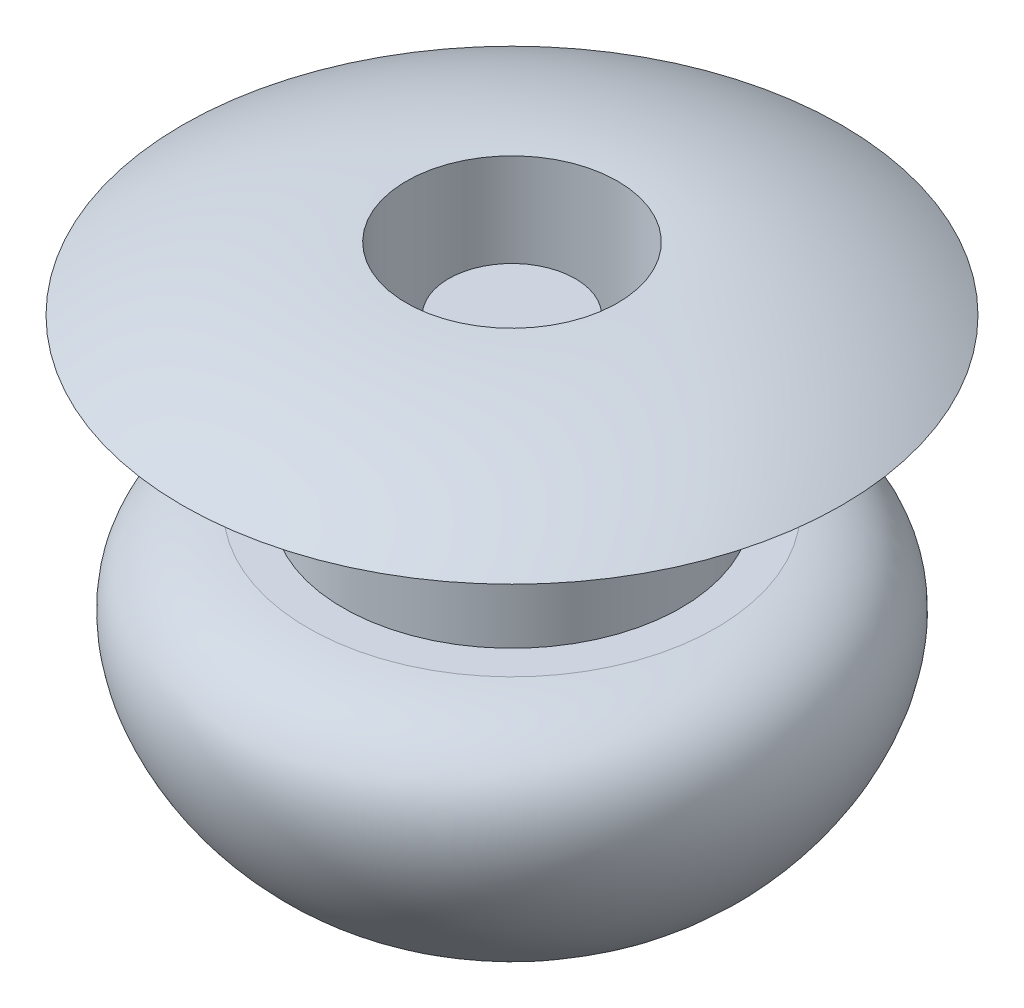
ISO-10303-21;
HEADER;
FILE_DESCRIPTION(('STEP AP214'),'2;1');
FILE_NAME('part.step','',(''),(''),'','','');
FILE_SCHEMA(('AUTOMOTIVE_DESIGN { 1 0 10303 214 1 1 1 1 }'));
ENDSEC;
DATA;
#1=APPLICATION_CONTEXT('core data for automotive mechanical design processes');
#2=APPLICATION_PROTOCOL_DEFINITION('international standard','automotive_design',2000,#1);
#3=PRODUCT_CONTEXT('',#1,'mechanical');
#4=PRODUCT('Part','Part','',(#3));
#5=PRODUCT_RELATED_PRODUCT_CATEGORY('part','',(#4));
#6=PRODUCT_DEFINITION_FORMATION('','',#4);
#7=PRODUCT_DEFINITION_CONTEXT('part definition',#1,'design');
#8=PRODUCT_DEFINITION('design','',#6,#7);
#9=PRODUCT_DEFINITION_SHAPE('','',#8);
#10=(LENGTH_UNIT() NAMED_UNIT(*) SI_UNIT(.MILLI.,.METRE.));
#11=(NAMED_UNIT(*) PLANE_ANGLE_UNIT() SI_UNIT($,.RADIAN.));
#12=(NAMED_UNIT(*) SI_UNIT($,.STERADIAN.) SOLID_ANGLE_UNIT());
#13=UNCERTAINTY_MEASURE_WITH_UNIT(LENGTH_MEASURE(1.E-05),#10,'distance_accuracy_value','');
#14=(GEOMETRIC_REPRESENTATION_CONTEXT(3) GLOBAL_UNCERTAINTY_ASSIGNED_CONTEXT((#13)) GLOBAL_UNIT_ASSIGNED_CONTEXT((#10,
#11,#12)) REPRESENTATION_CONTEXT('',''));
#15=CARTESIAN_POINT('',(0.,0.,0.));
#16=DIRECTION('',(0.,0.,1.));
#17=DIRECTION('',(1.,0.,0.));
#18=AXIS2_PLACEMENT_3D('',#15,#16,#17);
#19=CARTESIAN_POINT('',(0.,0.,0.));
#20=DIRECTION('',(0.,-1.,0.));
#21=DIRECTION('',(0.,0.,-1.));
#22=AXIS2_PLACEMENT_3D('',#19,#20,#21);
#23=PLANE('',#22);
#24=CARTESIAN_POINT('',(0.,0.,0.));
#25=DIRECTION('',(0.,-1.,0.));
#26=DIRECTION('',(0.,0.,-1.));
#27=AXIS2_PLACEMENT_3D('',#24,#25,#26);
#28=CIRCLE('',#27,0.75);
#29=CARTESIAN_POINT('',(0.,0.,-0.75));
#30=VERTEX_POINT('',#29);
#31=EDGE_CURVE('E11',#30,#30,#28,.T.);
#32=ORIENTED_EDGE('',*,*,#31,.F.);
#33=EDGE_LOOP('',(#32));
#34=FACE_BOUND('',#33,.T.);
#35=ADVANCED_FACE('F31',(#34),#23,.F.);
#36=CARTESIAN_POINT('',(0.,0.,0.));
#37=DIRECTION('',(0.,-1.,0.));
#38=DIRECTION('',(0.,0.,-1.));
#39=AXIS2_PLACEMENT_3D('',#36,#37,#38);
#40=CYLINDRICAL_SURFACE('',#39,0.75);
#41=CARTESIAN_POINT('',(0.,-2.20073852298997,0.));
#42=DIRECTION('',(0.,-1.,0.));
#43=DIRECTION('',(0.,0.,-1.));
#44=AXIS2_PLACEMENT_3D('',#41,#42,#43);
#45=CIRCLE('',#44,0.75);
#46=CARTESIAN_POINT('',(0.,-2.20073852298997,-0.75));
#47=VERTEX_POINT('',#46);
#48=EDGE_CURVE('E37',#47,#47,#45,.T.);
#49=ORIENTED_EDGE('',*,*,#48,.F.);
#50=EDGE_LOOP('',(#49));
#51=FACE_BOUND('',#50,.T.);
#52=ORIENTED_EDGE('',*,*,#31,.T.);
#53=EDGE_LOOP('',(#52));
#54=FACE_BOUND('',#53,.T.);
#55=ADVANCED_FACE('F76',(#51,#54),#40,.T.);
#56=CARTESIAN_POINT('',(2.22044604925031E-13,-2.20073852298997,0.750000000000695));
#57=DIRECTION('',(0.,-1.,0.));
#58=DIRECTION('',(0.,0.,-1.));
#59=AXIS2_PLACEMENT_3D('',#56,#57,#58);
#60=PLANE('',#59);
#61=CARTESIAN_POINT('',(0.,-2.20073852298997,0.));
#62=DIRECTION('',(0.,-1.,0.));
#63=DIRECTION('',(0.,0.,-1.));
#64=AXIS2_PLACEMENT_3D('',#61,#62,#63);
#65=CIRCLE('',#64,1.25);
#66=CARTESIAN_POINT('',(0.,-2.20073852298997,-1.25));
#67=VERTEX_POINT('',#66);
#68=EDGE_CURVE('E69',#67,#67,#65,.T.);
#69=ORIENTED_EDGE('',*,*,#68,.F.);
#70=EDGE_LOOP('',(#69));
#71=FACE_BOUND('',#70,.T.);
#72=ORIENTED_EDGE('',*,*,#48,.T.);
#73=EDGE_LOOP('',(#72));
#74=FACE_BOUND('',#73,.T.);
#75=ADVANCED_FACE('F74',(#71,#74),#60,.F.);
#76=CARTESIAN_POINT('',(0.,0.,0.));
#77=DIRECTION('',(0.,-1.,0.));
#78=DIRECTION('',(0.,0.,-1.));
#79=AXIS2_PLACEMENT_3D('',#76,#77,#78);
#80=CYLINDRICAL_SURFACE('',#79,1.25);
#81=CARTESIAN_POINT('',(0.,0.75,0.));
#82=DIRECTION('',(0.,-1.,0.));
#83=DIRECTION('',(0.,0.,-1.));
#84=AXIS2_PLACEMENT_3D('',#81,#82,#83);
#85=CIRCLE('',#84,1.25);
#86=CARTESIAN_POINT('',(0.,0.75,-1.25));
#87=VERTEX_POINT('',#86);
#88=EDGE_CURVE('E66',#87,#87,#85,.T.);
#89=ORIENTED_EDGE('',*,*,#88,.F.);
#90=EDGE_LOOP('',(#89));
#91=FACE_BOUND('',#90,.T.);
#92=ORIENTED_EDGE('',*,*,#68,.T.);
#93=EDGE_LOOP('',(#92));
#94=FACE_BOUND('',#93,.T.);
#95=ADVANCED_FACE('F94',(#91,#94),#80,.F.);
#96=CARTESIAN_POINT('',(0.,-4.30666666666667,0.));
#97=DIRECTION('',(0.,-1.,0.));
#98=DIRECTION('',(0.,0.,-1.));
#99=AXIS2_PLACEMENT_3D('',#96,#97,#98);
#100=DEGENERATE_TOROIDAL_SURFACE('',#99,1.25,5.05666666666667,.T.);
#101=CARTESIAN_POINT('',(0.,0.,0.));
#102=DIRECTION('',(0.,-1.,0.));
#103=DIRECTION('',(0.,0.,-1.));
#104=AXIS2_PLACEMENT_3D('',#101,#102,#103);
#105=CIRCLE('',#104,3.9);
#106=CARTESIAN_POINT('',(0.,0.,-3.9));
#107=VERTEX_POINT('',#106);
#108=EDGE_CURVE('E63',#107,#107,#105,.T.);
#109=ORIENTED_EDGE('',*,*,#108,.F.);
#110=EDGE_LOOP('',(#109));
#111=FACE_BOUND('',#110,.T.);
#112=ORIENTED_EDGE('',*,*,#88,.T.);
#113=EDGE_LOOP('',(#112));
#114=FACE_BOUND('',#113,.T.);
#115=ADVANCED_FACE('F102',(#111,#114),#100,.T.);
#116=CARTESIAN_POINT('',(0.,0.,3.90000000000001));
#117=DIRECTION('',(0.,1.,0.));
#118=DIRECTION('',(0.,0.,1.));
#119=AXIS2_PLACEMENT_3D('',#116,#117,#118);
#120=PLANE('',#119);
#121=CARTESIAN_POINT('',(0.,0.,0.));
#122=DIRECTION('',(0.,-1.,0.));
#123=DIRECTION('',(0.,0.,-1.));
#124=AXIS2_PLACEMENT_3D('',#121,#122,#123);
#125=CIRCLE('',#124,2.);
#126=CARTESIAN_POINT('',(0.,0.,-2.));
#127=VERTEX_POINT('',#126);
#128=EDGE_CURVE('E60',#127,#127,#125,.T.);
#129=ORIENTED_EDGE('',*,*,#128,.F.);
#130=EDGE_LOOP('',(#129));
#131=FACE_BOUND('',#130,.T.);
#132=ORIENTED_EDGE('',*,*,#108,.T.);
#133=EDGE_LOOP('',(#132));
#134=FACE_BOUND('',#133,.T.);
#135=ADVANCED_FACE('F110',(#131,#134),#120,.F.);
#136=CARTESIAN_POINT('',(0.,0.,0.));
#137=DIRECTION('',(0.,-1.,0.));
#138=DIRECTION('',(0.,0.,-1.));
#139=AXIS2_PLACEMENT_3D('',#136,#137,#138);
#140=CYLINDRICAL_SURFACE('',#139,2.);
#141=CARTESIAN_POINT('',(0.,-2.,0.));
#142=DIRECTION('',(0.,-1.,0.));
#143=DIRECTION('',(0.,0.,-1.));
#144=AXIS2_PLACEMENT_3D('',#141,#142,#143);
#145=CIRCLE('',#144,2.);
#146=CARTESIAN_POINT('',(0.,-2.,-2.));
#147=VERTEX_POINT('',#146);
#148=EDGE_CURVE('E52',#147,#147,#145,.T.);
#149=ORIENTED_EDGE('',*,*,#148,.F.);
#150=EDGE_LOOP('',(#149));
#151=FACE_BOUND('',#150,.T.);
#152=ORIENTED_EDGE('',*,*,#128,.T.);
#153=EDGE_LOOP('',(#152));
#154=FACE_BOUND('',#153,.T.);
#155=ADVANCED_FACE('F118',(#151,#154),#140,.T.);
#156=CARTESIAN_POINT('',(1.11022302462516E-13,-2.,2.00000000000022));
#157=DIRECTION('',(0.,-1.,0.));
#158=DIRECTION('',(0.,0.,-1.));
#159=AXIS2_PLACEMENT_3D('',#156,#157,#158);
#160=PLANE('',#159);
#161=CARTESIAN_POINT('',(0.,-2.,0.));
#162=DIRECTION('',(0.,-1.,0.));
#163=DIRECTION('',(0.,0.,-1.));
#164=AXIS2_PLACEMENT_3D('',#161,#162,#163);
#165=CIRCLE('',#164,2.4138917546613);
#166=CARTESIAN_POINT('',(0.,-2.,-2.4138917546613));
#167=VERTEX_POINT('',#166);
#168=EDGE_CURVE('E49',#167,#167,#165,.T.);
#169=ORIENTED_EDGE('',*,*,#168,.F.);
#170=EDGE_LOOP('',(#169));
#171=FACE_BOUND('',#170,.T.);
#172=ORIENTED_EDGE('',*,*,#148,.T.);
#173=EDGE_LOOP('',(#172));
#174=FACE_BOUND('',#173,.T.);
#175=ADVANCED_FACE('F126',(#171,#174),#160,.F.);
#176=CARTESIAN_POINT('',(8.88178419700125E-13,-2.,2.413891754662));
#177=CARTESIAN_POINT('',(0.,-2.16965732172857,3.86750311174056));
#178=CARTESIAN_POINT('',(4.44089209850063E-13,-4.30201362643837,3.52887764908694));
#179=CARTESIAN_POINT('',(6.66133814775094E-13,-5.87353236883243,1.08396164238544));
#180=CARTESIAN_POINT('',(3.33066907387547E-13,-3.87494929761665,0.27175261754997));
#181=CARTESIAN_POINT('',(0.,-3.57892919358065,0.956030426512822));
#182=B_SPLINE_CURVE_WITH_KNOTS('',3,(#176,#177,#178,#179,#180,#181),.UNSPECIFIED.,.F.,.F.,(4,1,
1,4),(0.,0.464993081764921,0.721927552661067,1.),.UNSPECIFIED.);
#183=CARTESIAN_POINT('',(0.,0.,0.));
#184=DIRECTION('',(0.,-1.,0.));
#185=AXIS1_PLACEMENT('',#183,#184);
#186=SURFACE_OF_REVOLUTION('',#182,#185);
#187=CARTESIAN_POINT('',(0.,-3.57892919358065,0.));
#188=DIRECTION('',(0.,-1.,0.));
#189=DIRECTION('',(0.,0.,-1.));
#190=AXIS2_PLACEMENT_3D('',#187,#188,#189);
#191=CIRCLE('',#190,0.956030426512505);
#192=CARTESIAN_POINT('',(0.,-3.57892919358065,-0.956030426512505));
#193=VERTEX_POINT('',#192);
#194=EDGE_CURVE('E47',#193,#193,#191,.T.);
#195=ORIENTED_EDGE('',*,*,#194,.F.);
#196=EDGE_LOOP('',(#195));
#197=FACE_BOUND('',#196,.T.);
#198=ORIENTED_EDGE('',*,*,#168,.T.);
#199=EDGE_LOOP('',(#198));
#200=FACE_BOUND('',#199,.T.);
#201=ADVANCED_FACE('F43',(#197,#200),#186,.T.);
#202=CARTESIAN_POINT('',(0.,-2.95073852298997,0.));
#203=DIRECTION('',(1.,0.,0.));
#204=DIRECTION('',(0.,0.,1.));
#205=AXIS2_PLACEMENT_3D('',#202,#203,#204);
#206=ELLIPSE('',#205,1.75,0.749999999999999);
#207=TRIMMED_CURVE('',#206,(PARAMETER_VALUE(-1.5707963267949)),
(PARAMETER_VALUE(1.5707963267949)),.T.,.PARAMETER.);
#208=CARTESIAN_POINT('',(0.,0.,0.));
#209=DIRECTION('',(0.,-1.,0.));
#210=AXIS1_PLACEMENT('',#208,#209);
#211=SURFACE_OF_REVOLUTION('',#207,#210);
#212=CARTESIAN_POINT('',(0.,-3.70073852298997,0.));
#213=VERTEX_POINT('',#212);
#214=VERTEX_LOOP('',#213);
#215=FACE_BOUND('',#214,.T.);
#216=ORIENTED_EDGE('',*,*,#194,.T.);
#217=EDGE_LOOP('',(#216));
#218=FACE_BOUND('',#217,.T.);
#219=ADVANCED_FACE('F40',(#215,#218),#211,.T.);
#220=CLOSED_SHELL('',(#35,#55,#75,#95,#115,#135,#155,#175,#201,#219));
#221=MANIFOLD_SOLID_BREP('B2',#220);
#222=ADVANCED_BREP_SHAPE_REPRESENTATION('',(#18,#221),#14);
#223=SHAPE_DEFINITION_REPRESENTATION(#9,#222);
ENDSEC;
END-ISO-10303-21;
